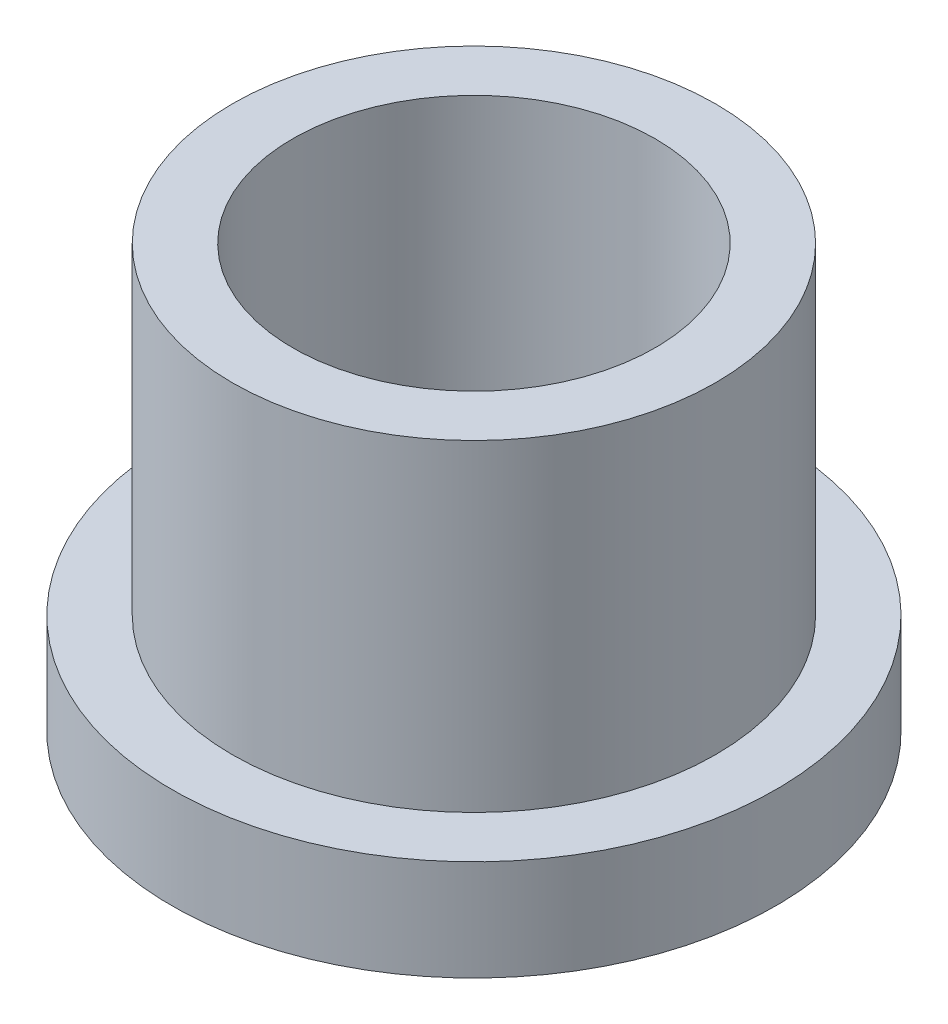
ISO-10303-21;
HEADER;
FILE_DESCRIPTION(('STEP AP214'),'2;1');
FILE_NAME('part.step','',(''),(''),'','','');
FILE_SCHEMA(('AUTOMOTIVE_DESIGN { 1 0 10303 214 1 1 1 1 }'));
ENDSEC;
DATA;
#1=APPLICATION_CONTEXT('core data for automotive mechanical design processes');
#2=APPLICATION_PROTOCOL_DEFINITION('international standard','automotive_design',2000,#1);
#3=PRODUCT_CONTEXT('',#1,'mechanical');
#4=PRODUCT('Part','Part','',(#3));
#5=PRODUCT_RELATED_PRODUCT_CATEGORY('part','',(#4));
#6=PRODUCT_DEFINITION_FORMATION('','',#4);
#7=PRODUCT_DEFINITION_CONTEXT('part definition',#1,'design');
#8=PRODUCT_DEFINITION('design','',#6,#7);
#9=PRODUCT_DEFINITION_SHAPE('','',#8);
#10=(LENGTH_UNIT() NAMED_UNIT(*) SI_UNIT(.MILLI.,.METRE.));
#11=(NAMED_UNIT(*) PLANE_ANGLE_UNIT() SI_UNIT($,.RADIAN.));
#12=(NAMED_UNIT(*) SI_UNIT($,.STERADIAN.) SOLID_ANGLE_UNIT());
#13=UNCERTAINTY_MEASURE_WITH_UNIT(LENGTH_MEASURE(1.E-05),#10,'distance_accuracy_value','');
#14=(GEOMETRIC_REPRESENTATION_CONTEXT(3) GLOBAL_UNCERTAINTY_ASSIGNED_CONTEXT((#13)) GLOBAL_UNIT_ASSIGNED_CONTEXT((#10,
#11,#12)) REPRESENTATION_CONTEXT('',''));
#15=CARTESIAN_POINT('',(0.,0.,0.));
#16=DIRECTION('',(0.,0.,1.));
#17=DIRECTION('',(1.,0.,0.));
#18=AXIS2_PLACEMENT_3D('',#15,#16,#17);
#19=CARTESIAN_POINT('',(15.,0.,0.));
#20=DIRECTION('',(0.,-1.,0.));
#21=DIRECTION('',(0.,0.,-1.));
#22=AXIS2_PLACEMENT_3D('',#19,#20,#21);
#23=PLANE('',#22);
#24=CARTESIAN_POINT('',(0.,0.,0.));
#25=DIRECTION('',(0.,-1.,0.));
#26=DIRECTION('',(0.,0.,-1.));
#27=AXIS2_PLACEMENT_3D('',#24,#25,#26);
#28=CIRCLE('',#27,15.);
#29=CARTESIAN_POINT('',(0.,0.,-15.));
#30=VERTEX_POINT('',#29);
#31=EDGE_CURVE('E70',#30,#30,#28,.T.);
#32=ORIENTED_EDGE('',*,*,#31,.T.);
#33=EDGE_LOOP('',(#32));
#34=FACE_BOUND('',#33,.T.);
#35=CARTESIAN_POINT('',(0.,0.,0.));
#36=DIRECTION('',(0.,-1.,0.));
#37=DIRECTION('',(0.,0.,-1.));
#38=AXIS2_PLACEMENT_3D('',#35,#36,#37);
#39=CIRCLE('',#38,9.);
#40=CARTESIAN_POINT('',(0.,0.,-9.));
#41=VERTEX_POINT('',#40);
#42=EDGE_CURVE('E10',#41,#41,#39,.T.);
#43=ORIENTED_EDGE('',*,*,#42,.F.);
#44=EDGE_LOOP('',(#43));
#45=FACE_BOUND('',#44,.T.);
#46=ADVANCED_FACE('F43',(#34,#45),#23,.T.);
#47=CARTESIAN_POINT('',(0.,0.,0.));
#48=DIRECTION('',(0.,-1.,0.));
#49=DIRECTION('',(0.,0.,-1.));
#50=AXIS2_PLACEMENT_3D('',#47,#48,#49);
#51=CYLINDRICAL_SURFACE('',#50,9.);
#52=ORIENTED_EDGE('',*,*,#42,.T.);
#53=EDGE_LOOP('',(#52));
#54=FACE_BOUND('',#53,.T.);
#55=CARTESIAN_POINT('',(0.,21.,0.));
#56=DIRECTION('',(0.,-1.,0.));
#57=DIRECTION('',(0.,0.,-1.));
#58=AXIS2_PLACEMENT_3D('',#55,#56,#57);
#59=CIRCLE('',#58,9.);
#60=CARTESIAN_POINT('',(0.,21.,-9.));
#61=VERTEX_POINT('',#60);
#62=EDGE_CURVE('E50',#61,#61,#59,.T.);
#63=ORIENTED_EDGE('',*,*,#62,.F.);
#64=EDGE_LOOP('',(#63));
#65=FACE_BOUND('',#64,.T.);
#66=ADVANCED_FACE('F89',(#54,#65),#51,.F.);
#67=CARTESIAN_POINT('',(9.,21.,0.));
#68=DIRECTION('',(0.,1.,0.));
#69=DIRECTION('',(0.,0.,1.));
#70=AXIS2_PLACEMENT_3D('',#67,#68,#69);
#71=PLANE('',#70);
#72=ORIENTED_EDGE('',*,*,#62,.T.);
#73=EDGE_LOOP('',(#72));
#74=FACE_BOUND('',#73,.T.);
#75=CARTESIAN_POINT('',(0.,21.,0.));
#76=DIRECTION('',(0.,-1.,0.));
#77=DIRECTION('',(0.,0.,-1.));
#78=AXIS2_PLACEMENT_3D('',#75,#76,#77);
#79=CIRCLE('',#78,12.);
#80=CARTESIAN_POINT('',(0.,21.,-12.));
#81=VERTEX_POINT('',#80);
#82=EDGE_CURVE('E55',#81,#81,#79,.T.);
#83=ORIENTED_EDGE('',*,*,#82,.F.);
#84=EDGE_LOOP('',(#83));
#85=FACE_BOUND('',#84,.T.);
#86=ADVANCED_FACE('F93',(#74,#85),#71,.T.);
#87=CARTESIAN_POINT('',(0.,0.,0.));
#88=DIRECTION('',(0.,-1.,0.));
#89=DIRECTION('',(0.,0.,-1.));
#90=AXIS2_PLACEMENT_3D('',#87,#88,#89);
#91=CYLINDRICAL_SURFACE('',#90,12.);
#92=ORIENTED_EDGE('',*,*,#82,.T.);
#93=EDGE_LOOP('',(#92));
#94=FACE_BOUND('',#93,.T.);
#95=CARTESIAN_POINT('',(0.,5.,0.));
#96=DIRECTION('',(0.,-1.,0.));
#97=DIRECTION('',(0.,0.,-1.));
#98=AXIS2_PLACEMENT_3D('',#95,#96,#97);
#99=CIRCLE('',#98,12.);
#100=CARTESIAN_POINT('',(0.,5.,-12.));
#101=VERTEX_POINT('',#100);
#102=EDGE_CURVE('E60',#101,#101,#99,.T.);
#103=ORIENTED_EDGE('',*,*,#102,.F.);
#104=EDGE_LOOP('',(#103));
#105=FACE_BOUND('',#104,.T.);
#106=ADVANCED_FACE('F85',(#94,#105),#91,.T.);
#107=CARTESIAN_POINT('',(12.,5.,0.));
#108=DIRECTION('',(0.,1.,0.));
#109=DIRECTION('',(0.,0.,1.));
#110=AXIS2_PLACEMENT_3D('',#107,#108,#109);
#111=PLANE('',#110);
#112=ORIENTED_EDGE('',*,*,#102,.T.);
#113=EDGE_LOOP('',(#112));
#114=FACE_BOUND('',#113,.T.);
#115=CARTESIAN_POINT('',(0.,5.,0.));
#116=DIRECTION('',(0.,-1.,0.));
#117=DIRECTION('',(0.,0.,-1.));
#118=AXIS2_PLACEMENT_3D('',#115,#116,#117);
#119=CIRCLE('',#118,15.);
#120=CARTESIAN_POINT('',(0.,5.,-15.));
#121=VERTEX_POINT('',#120);
#122=EDGE_CURVE('E66',#121,#121,#119,.T.);
#123=ORIENTED_EDGE('',*,*,#122,.F.);
#124=EDGE_LOOP('',(#123));
#125=FACE_BOUND('',#124,.T.);
#126=ADVANCED_FACE('F79',(#114,#125),#111,.T.);
#127=CARTESIAN_POINT('',(0.,0.,0.));
#128=DIRECTION('',(0.,-1.,0.));
#129=DIRECTION('',(0.,0.,-1.));
#130=AXIS2_PLACEMENT_3D('',#127,#128,#129);
#131=CYLINDRICAL_SURFACE('',#130,15.);
#132=ORIENTED_EDGE('',*,*,#122,.T.);
#133=EDGE_LOOP('',(#132));
#134=FACE_BOUND('',#133,.T.);
#135=ORIENTED_EDGE('',*,*,#31,.F.);
#136=EDGE_LOOP('',(#135));
#137=FACE_BOUND('',#136,.T.);
#138=ADVANCED_FACE('F77',(#134,#137),#131,.T.);
#139=CLOSED_SHELL('',(#46,#66,#86,#106,#126,#138));
#140=MANIFOLD_SOLID_BREP('B2',#139);
#141=ADVANCED_BREP_SHAPE_REPRESENTATION('',(#18,#140),#14);
#142=SHAPE_DEFINITION_REPRESENTATION(#9,#141);
ENDSEC;
END-ISO-10303-21;
